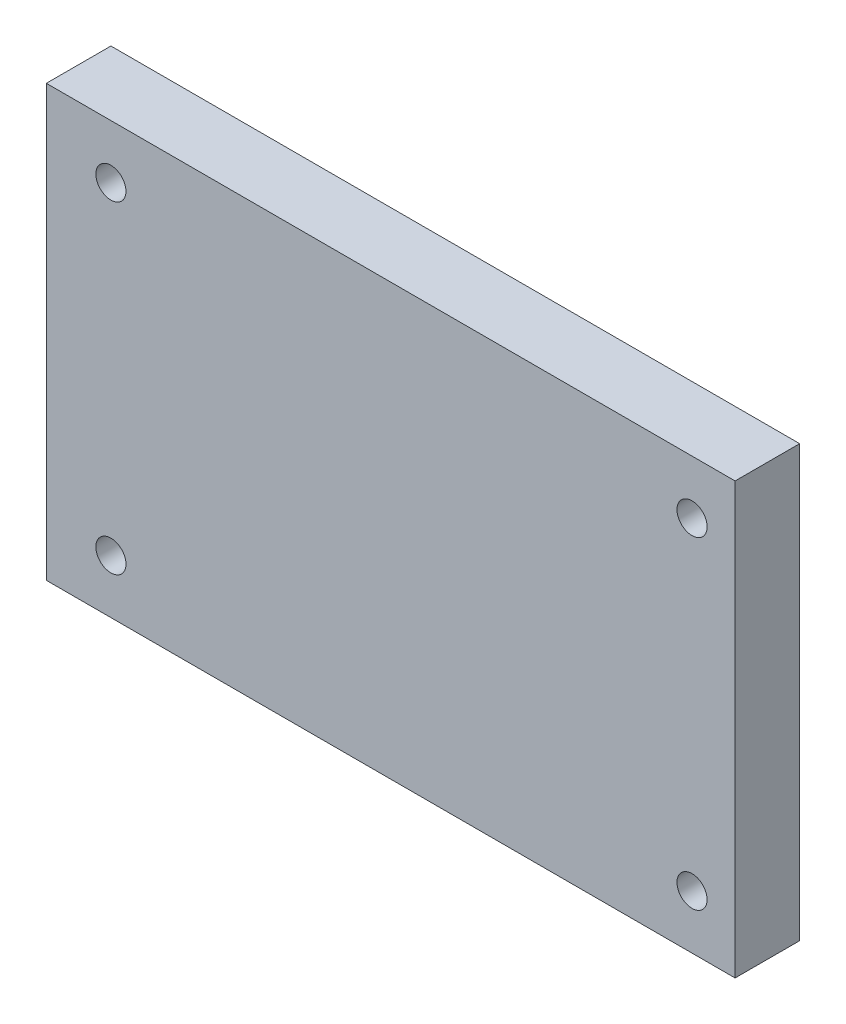
ISO-10303-21;
HEADER;
FILE_DESCRIPTION(('STEP AP214'),'2;1');
FILE_NAME('part.step','',(''),(''),'','','');
FILE_SCHEMA(('AUTOMOTIVE_DESIGN { 1 0 10303 214 1 1 1 1 }'));
ENDSEC;
DATA;
#1=APPLICATION_CONTEXT('core data for automotive mechanical design processes');
#2=APPLICATION_PROTOCOL_DEFINITION('international standard','automotive_design',2000,#1);
#3=PRODUCT_CONTEXT('',#1,'mechanical');
#4=PRODUCT('Part','Part','',(#3));
#5=PRODUCT_RELATED_PRODUCT_CATEGORY('part','',(#4));
#6=PRODUCT_DEFINITION_FORMATION('','',#4);
#7=PRODUCT_DEFINITION_CONTEXT('part definition',#1,'design');
#8=PRODUCT_DEFINITION('design','',#6,#7);
#9=PRODUCT_DEFINITION_SHAPE('','',#8);
#10=(LENGTH_UNIT() NAMED_UNIT(*) SI_UNIT(.MILLI.,.METRE.));
#11=(NAMED_UNIT(*) PLANE_ANGLE_UNIT() SI_UNIT($,.RADIAN.));
#12=(NAMED_UNIT(*) SI_UNIT($,.STERADIAN.) SOLID_ANGLE_UNIT());
#13=UNCERTAINTY_MEASURE_WITH_UNIT(LENGTH_MEASURE(1.E-05),#10,'distance_accuracy_value','');
#14=(GEOMETRIC_REPRESENTATION_CONTEXT(3) GLOBAL_UNCERTAINTY_ASSIGNED_CONTEXT((#13)) GLOBAL_UNIT_ASSIGNED_CONTEXT((#10,
#11,#12)) REPRESENTATION_CONTEXT('',''));
#15=CARTESIAN_POINT('',(0.,0.,0.));
#16=DIRECTION('',(0.,0.,1.));
#17=DIRECTION('',(1.,0.,0.));
#18=AXIS2_PLACEMENT_3D('',#15,#16,#17);
#19=CARTESIAN_POINT('',(-16.,-10.,3.));
#20=DIRECTION('',(1.,0.,0.));
#21=DIRECTION('',(0.,0.,-1.));
#22=AXIS2_PLACEMENT_3D('',#19,#20,#21);
#23=PLANE('',#22);
#24=DIRECTION('',(0.,-1.,0.));
#25=VECTOR('',#24,1.);
#26=CARTESIAN_POINT('',(-16.,-10.,0.));
#27=LINE('',#26,#25);
#28=CARTESIAN_POINT('',(-16.,10.,0.));
#29=VERTEX_POINT('',#28);
#30=CARTESIAN_POINT('',(-16.,-10.,0.));
#31=VERTEX_POINT('',#30);
#32=EDGE_CURVE('E96',#29,#31,#27,.T.);
#33=ORIENTED_EDGE('',*,*,#32,.T.);
#34=DIRECTION('',(0.,0.,-1.));
#35=VECTOR('',#34,1.);
#36=CARTESIAN_POINT('',(-16.,-10.,3.));
#37=LINE('',#36,#35);
#38=CARTESIAN_POINT('',(-16.,-10.,3.));
#39=VERTEX_POINT('',#38);
#40=EDGE_CURVE('E11',#39,#31,#37,.T.);
#41=ORIENTED_EDGE('',*,*,#40,.F.);
#42=DIRECTION('',(0.,-1.,0.));
#43=VECTOR('',#42,1.);
#44=CARTESIAN_POINT('',(-16.,-10.,3.));
#45=LINE('',#44,#43);
#46=CARTESIAN_POINT('',(-16.,10.,3.));
#47=VERTEX_POINT('',#46);
#48=EDGE_CURVE('E84',#47,#39,#45,.T.);
#49=ORIENTED_EDGE('',*,*,#48,.F.);
#50=DIRECTION('',(0.,0.,-1.));
#51=VECTOR('',#50,1.);
#52=CARTESIAN_POINT('',(-16.,10.,3.));
#53=LINE('',#52,#51);
#54=EDGE_CURVE('E92',#47,#29,#53,.T.);
#55=ORIENTED_EDGE('',*,*,#54,.T.);
#56=EDGE_LOOP('',(#33,#41,#49,#55));
#57=FACE_BOUND('',#56,.T.);
#58=ADVANCED_FACE('F33',(#57),#23,.F.);
#59=CARTESIAN_POINT('',(16.,-10.,3.));
#60=DIRECTION('',(0.,1.,0.));
#61=DIRECTION('',(-1.,0.,0.));
#62=AXIS2_PLACEMENT_3D('',#59,#60,#61);
#63=PLANE('',#62);
#64=DIRECTION('',(1.,0.,0.));
#65=VECTOR('',#64,1.);
#66=CARTESIAN_POINT('',(16.,-10.,0.));
#67=LINE('',#66,#65);
#68=CARTESIAN_POINT('',(16.,-10.,0.));
#69=VERTEX_POINT('',#68);
#70=EDGE_CURVE('E88',#31,#69,#67,.T.);
#71=ORIENTED_EDGE('',*,*,#70,.T.);
#72=DIRECTION('',(0.,0.,-1.));
#73=VECTOR('',#72,1.);
#74=CARTESIAN_POINT('',(16.,-10.,3.));
#75=LINE('',#74,#73);
#76=CARTESIAN_POINT('',(16.,-10.,3.));
#77=VERTEX_POINT('',#76);
#78=EDGE_CURVE('E41',#77,#69,#75,.T.);
#79=ORIENTED_EDGE('',*,*,#78,.F.);
#80=DIRECTION('',(1.,0.,0.));
#81=VECTOR('',#80,1.);
#82=CARTESIAN_POINT('',(16.,-10.,3.));
#83=LINE('',#82,#81);
#84=EDGE_CURVE('E79',#39,#77,#83,.T.);
#85=ORIENTED_EDGE('',*,*,#84,.F.);
#86=ORIENTED_EDGE('',*,*,#40,.T.);
#87=EDGE_LOOP('',(#71,#79,#85,#86));
#88=FACE_BOUND('',#87,.T.);
#89=ADVANCED_FACE('F87',(#88),#63,.F.);
#90=CARTESIAN_POINT('',(16.,-10.,3.));
#91=DIRECTION('',(-1.,0.,0.));
#92=DIRECTION('',(0.,0.,1.));
#93=AXIS2_PLACEMENT_3D('',#90,#91,#92);
#94=PLANE('',#93);
#95=DIRECTION('',(0.,1.,0.));
#96=VECTOR('',#95,1.);
#97=CARTESIAN_POINT('',(16.,-10.,0.));
#98=LINE('',#97,#96);
#99=CARTESIAN_POINT('',(16.,10.,0.));
#100=VERTEX_POINT('',#99);
#101=EDGE_CURVE('E66',#69,#100,#98,.T.);
#102=ORIENTED_EDGE('',*,*,#101,.T.);
#103=DIRECTION('',(0.,0.,-1.));
#104=VECTOR('',#103,1.);
#105=CARTESIAN_POINT('',(16.,10.,3.));
#106=LINE('',#105,#104);
#107=CARTESIAN_POINT('',(16.,10.,3.));
#108=VERTEX_POINT('',#107);
#109=EDGE_CURVE('E89',#108,#100,#106,.T.);
#110=ORIENTED_EDGE('',*,*,#109,.F.);
#111=DIRECTION('',(0.,1.,0.));
#112=VECTOR('',#111,1.);
#113=CARTESIAN_POINT('',(16.,-10.,3.));
#114=LINE('',#113,#112);
#115=EDGE_CURVE('E82',#77,#108,#114,.T.);
#116=ORIENTED_EDGE('',*,*,#115,.F.);
#117=ORIENTED_EDGE('',*,*,#78,.T.);
#118=EDGE_LOOP('',(#102,#110,#116,#117));
#119=FACE_BOUND('',#118,.T.);
#120=ADVANCED_FACE('F90',(#119),#94,.F.);
#121=CARTESIAN_POINT('',(16.,10.,3.));
#122=DIRECTION('',(0.,-1.,0.));
#123=DIRECTION('',(1.,0.,0.));
#124=AXIS2_PLACEMENT_3D('',#121,#122,#123);
#125=PLANE('',#124);
#126=DIRECTION('',(-1.,0.,0.));
#127=VECTOR('',#126,1.);
#128=CARTESIAN_POINT('',(16.,10.,0.));
#129=LINE('',#128,#127);
#130=EDGE_CURVE('E72',#100,#29,#129,.T.);
#131=ORIENTED_EDGE('',*,*,#130,.T.);
#132=ORIENTED_EDGE('',*,*,#54,.F.);
#133=DIRECTION('',(-1.,0.,0.));
#134=VECTOR('',#133,1.);
#135=CARTESIAN_POINT('',(16.,10.,3.));
#136=LINE('',#135,#134);
#137=EDGE_CURVE('E49',#108,#47,#136,.T.);
#138=ORIENTED_EDGE('',*,*,#137,.F.);
#139=ORIENTED_EDGE('',*,*,#109,.T.);
#140=EDGE_LOOP('',(#131,#132,#138,#139));
#141=FACE_BOUND('',#140,.T.);
#142=ADVANCED_FACE('F104',(#141),#125,.F.);
#143=CARTESIAN_POINT('',(0.,0.,3.));
#144=DIRECTION('',(0.,0.,1.));
#145=DIRECTION('',(1.,0.,0.));
#146=AXIS2_PLACEMENT_3D('',#143,#144,#145);
#147=PLANE('',#146);
#148=CARTESIAN_POINT('',(14.,7.5,3.));
#149=DIRECTION('',(0.,0.,1.));
#150=DIRECTION('',(-1.,0.,0.));
#151=AXIS2_PLACEMENT_3D('',#148,#149,#150);
#152=CIRCLE('',#151,0.7);
#153=CARTESIAN_POINT('',(13.3,7.5,3.));
#154=VERTEX_POINT('',#153);
#155=EDGE_CURVE('E116',#154,#154,#152,.T.);
#156=ORIENTED_EDGE('',*,*,#155,.F.);
#157=EDGE_LOOP('',(#156));
#158=FACE_BOUND('',#157,.T.);
#159=CARTESIAN_POINT('',(-13.,-7.5,3.));
#160=DIRECTION('',(0.,0.,1.));
#161=DIRECTION('',(-1.,0.,0.));
#162=AXIS2_PLACEMENT_3D('',#159,#160,#161);
#163=CIRCLE('',#162,0.7);
#164=CARTESIAN_POINT('',(-13.7,-7.5,3.));
#165=VERTEX_POINT('',#164);
#166=EDGE_CURVE('E122',#165,#165,#163,.T.);
#167=ORIENTED_EDGE('',*,*,#166,.F.);
#168=EDGE_LOOP('',(#167));
#169=FACE_BOUND('',#168,.T.);
#170=CARTESIAN_POINT('',(14.,-7.5,3.));
#171=DIRECTION('',(0.,0.,1.));
#172=DIRECTION('',(1.,0.,0.));
#173=AXIS2_PLACEMENT_3D('',#170,#171,#172);
#174=CIRCLE('',#173,0.7);
#175=CARTESIAN_POINT('',(14.7,-7.5,3.));
#176=VERTEX_POINT('',#175);
#177=EDGE_CURVE('E128',#176,#176,#174,.T.);
#178=ORIENTED_EDGE('',*,*,#177,.F.);
#179=EDGE_LOOP('',(#178));
#180=FACE_BOUND('',#179,.T.);
#181=CARTESIAN_POINT('',(-13.,7.5,3.));
#182=DIRECTION('',(0.,0.,1.));
#183=DIRECTION('',(1.,0.,0.));
#184=AXIS2_PLACEMENT_3D('',#181,#182,#183);
#185=CIRCLE('',#184,0.7);
#186=CARTESIAN_POINT('',(-12.3,7.5,3.));
#187=VERTEX_POINT('',#186);
#188=EDGE_CURVE('E110',#187,#187,#185,.T.);
#189=ORIENTED_EDGE('',*,*,#188,.F.);
#190=EDGE_LOOP('',(#189));
#191=FACE_BOUND('',#190,.T.);
#192=ORIENTED_EDGE('',*,*,#48,.T.);
#193=ORIENTED_EDGE('',*,*,#84,.T.);
#194=ORIENTED_EDGE('',*,*,#115,.T.);
#195=ORIENTED_EDGE('',*,*,#137,.T.);
#196=EDGE_LOOP('',(#192,#193,#194,#195));
#197=FACE_BOUND('',#196,.T.);
#198=ADVANCED_FACE('F80',(#158,#169,#180,#191,#197),#147,.T.);
#199=CARTESIAN_POINT('',(0.,0.,0.));
#200=DIRECTION('',(0.,0.,1.));
#201=DIRECTION('',(1.,0.,0.));
#202=AXIS2_PLACEMENT_3D('',#199,#200,#201);
#203=PLANE('',#202);
#204=CARTESIAN_POINT('',(14.,7.5,0.));
#205=DIRECTION('',(0.,0.,1.));
#206=DIRECTION('',(-1.,0.,0.));
#207=AXIS2_PLACEMENT_3D('',#204,#205,#206);
#208=CIRCLE('',#207,0.7);
#209=CARTESIAN_POINT('',(13.3,7.5,0.));
#210=VERTEX_POINT('',#209);
#211=EDGE_CURVE('E119',#210,#210,#208,.T.);
#212=ORIENTED_EDGE('',*,*,#211,.T.);
#213=EDGE_LOOP('',(#212));
#214=FACE_BOUND('',#213,.T.);
#215=CARTESIAN_POINT('',(-13.,-7.5,0.));
#216=DIRECTION('',(0.,0.,1.));
#217=DIRECTION('',(-1.,0.,0.));
#218=AXIS2_PLACEMENT_3D('',#215,#216,#217);
#219=CIRCLE('',#218,0.7);
#220=CARTESIAN_POINT('',(-13.7,-7.5,0.));
#221=VERTEX_POINT('',#220);
#222=EDGE_CURVE('E125',#221,#221,#219,.T.);
#223=ORIENTED_EDGE('',*,*,#222,.T.);
#224=EDGE_LOOP('',(#223));
#225=FACE_BOUND('',#224,.T.);
#226=CARTESIAN_POINT('',(14.,-7.5,0.));
#227=DIRECTION('',(0.,0.,1.));
#228=DIRECTION('',(1.,0.,0.));
#229=AXIS2_PLACEMENT_3D('',#226,#227,#228);
#230=CIRCLE('',#229,0.7);
#231=CARTESIAN_POINT('',(14.7,-7.5,0.));
#232=VERTEX_POINT('',#231);
#233=EDGE_CURVE('E113',#232,#232,#230,.T.);
#234=ORIENTED_EDGE('',*,*,#233,.T.);
#235=EDGE_LOOP('',(#234));
#236=FACE_BOUND('',#235,.T.);
#237=CARTESIAN_POINT('',(-13.,7.5,0.));
#238=DIRECTION('',(0.,0.,1.));
#239=DIRECTION('',(1.,0.,0.));
#240=AXIS2_PLACEMENT_3D('',#237,#238,#239);
#241=CIRCLE('',#240,0.7);
#242=CARTESIAN_POINT('',(-12.3,7.5,0.));
#243=VERTEX_POINT('',#242);
#244=EDGE_CURVE('E99',#243,#243,#241,.T.);
#245=ORIENTED_EDGE('',*,*,#244,.T.);
#246=EDGE_LOOP('',(#245));
#247=FACE_BOUND('',#246,.T.);
#248=ORIENTED_EDGE('',*,*,#32,.F.);
#249=ORIENTED_EDGE('',*,*,#130,.F.);
#250=ORIENTED_EDGE('',*,*,#101,.F.);
#251=ORIENTED_EDGE('',*,*,#70,.F.);
#252=EDGE_LOOP('',(#248,#249,#250,#251));
#253=FACE_BOUND('',#252,.T.);
#254=ADVANCED_FACE('F107',(#214,#225,#236,#247,#253),#203,.F.);
#255=CARTESIAN_POINT('',(-13.,7.5,0.));
#256=DIRECTION('',(0.,0.,1.));
#257=DIRECTION('',(1.,0.,0.));
#258=AXIS2_PLACEMENT_3D('',#255,#256,#257);
#259=CYLINDRICAL_SURFACE('',#258,0.7);
#260=ORIENTED_EDGE('',*,*,#244,.F.);
#261=EDGE_LOOP('',(#260));
#262=FACE_BOUND('',#261,.T.);
#263=ORIENTED_EDGE('',*,*,#188,.T.);
#264=EDGE_LOOP('',(#263));
#265=FACE_BOUND('',#264,.T.);
#266=ADVANCED_FACE('F140',(#262,#265),#259,.F.);
#267=CARTESIAN_POINT('',(14.,-7.5,0.));
#268=DIRECTION('',(0.,0.,1.));
#269=DIRECTION('',(1.,0.,0.));
#270=AXIS2_PLACEMENT_3D('',#267,#268,#269);
#271=CYLINDRICAL_SURFACE('',#270,0.7);
#272=ORIENTED_EDGE('',*,*,#233,.F.);
#273=EDGE_LOOP('',(#272));
#274=FACE_BOUND('',#273,.T.);
#275=ORIENTED_EDGE('',*,*,#177,.T.);
#276=EDGE_LOOP('',(#275));
#277=FACE_BOUND('',#276,.T.);
#278=ADVANCED_FACE('F136',(#274,#277),#271,.F.);
#279=CARTESIAN_POINT('',(-13.,-7.5,0.));
#280=DIRECTION('',(0.,0.,1.));
#281=DIRECTION('',(1.,0.,0.));
#282=AXIS2_PLACEMENT_3D('',#279,#280,#281);
#283=CYLINDRICAL_SURFACE('',#282,0.7);
#284=ORIENTED_EDGE('',*,*,#222,.F.);
#285=EDGE_LOOP('',(#284));
#286=FACE_BOUND('',#285,.T.);
#287=ORIENTED_EDGE('',*,*,#166,.T.);
#288=EDGE_LOOP('',(#287));
#289=FACE_BOUND('',#288,.T.);
#290=ADVANCED_FACE('F139',(#286,#289),#283,.F.);
#291=CARTESIAN_POINT('',(14.,7.5,0.));
#292=DIRECTION('',(0.,0.,1.));
#293=DIRECTION('',(1.,0.,0.));
#294=AXIS2_PLACEMENT_3D('',#291,#292,#293);
#295=CYLINDRICAL_SURFACE('',#294,0.7);
#296=ORIENTED_EDGE('',*,*,#211,.F.);
#297=EDGE_LOOP('',(#296));
#298=FACE_BOUND('',#297,.T.);
#299=ORIENTED_EDGE('',*,*,#155,.T.);
#300=EDGE_LOOP('',(#299));
#301=FACE_BOUND('',#300,.T.);
#302=ADVANCED_FACE('F201',(#298,#301),#295,.F.);
#303=CLOSED_SHELL('',(#58,#89,#120,#142,#198,#254,#266,#278,#290,#302));
#304=MANIFOLD_SOLID_BREP('B2',#303);
#305=ADVANCED_BREP_SHAPE_REPRESENTATION('',(#18,#304),#14);
#306=SHAPE_DEFINITION_REPRESENTATION(#9,#305);
ENDSEC;
END-ISO-10303-21;
